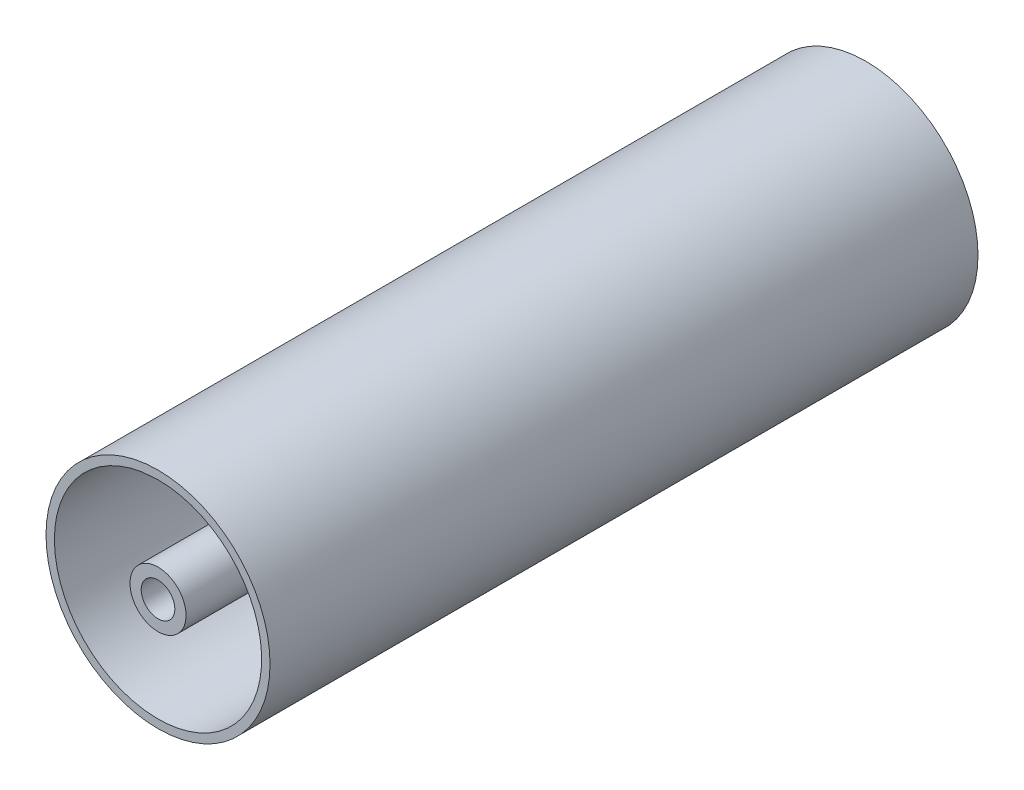
ISO-10303-21;
HEADER;
FILE_DESCRIPTION(('STEP AP214'),'2;1');
FILE_NAME('part.step','',(''),(''),'','','');
FILE_SCHEMA(('AUTOMOTIVE_DESIGN { 1 0 10303 214 1 1 1 1 }'));
ENDSEC;
DATA;
#1=APPLICATION_CONTEXT('core data for automotive mechanical design processes');
#2=APPLICATION_PROTOCOL_DEFINITION('international standard','automotive_design',2000,#1);
#3=PRODUCT_CONTEXT('',#1,'mechanical');
#4=PRODUCT('Part','Part','',(#3));
#5=PRODUCT_RELATED_PRODUCT_CATEGORY('part','',(#4));
#6=PRODUCT_DEFINITION_FORMATION('','',#4);
#7=PRODUCT_DEFINITION_CONTEXT('part definition',#1,'design');
#8=PRODUCT_DEFINITION('design','',#6,#7);
#9=PRODUCT_DEFINITION_SHAPE('','',#8);
#10=(LENGTH_UNIT() NAMED_UNIT(*) SI_UNIT(.MILLI.,.METRE.));
#11=(NAMED_UNIT(*) PLANE_ANGLE_UNIT() SI_UNIT($,.RADIAN.));
#12=(NAMED_UNIT(*) SI_UNIT($,.STERADIAN.) SOLID_ANGLE_UNIT());
#13=UNCERTAINTY_MEASURE_WITH_UNIT(LENGTH_MEASURE(1.E-05),#10,'distance_accuracy_value','');
#14=(GEOMETRIC_REPRESENTATION_CONTEXT(3) GLOBAL_UNCERTAINTY_ASSIGNED_CONTEXT((#13)) GLOBAL_UNIT_ASSIGNED_CONTEXT((#10,
#11,#12)) REPRESENTATION_CONTEXT('',''));
#15=CARTESIAN_POINT('',(0.,0.,0.));
#16=DIRECTION('',(0.,0.,1.));
#17=DIRECTION('',(1.,0.,0.));
#18=AXIS2_PLACEMENT_3D('',#15,#16,#17);
#19=CARTESIAN_POINT('',(0.,0.,53.257864376273));
#20=DIRECTION('',(0.,0.,1.));
#21=DIRECTION('',(1.,0.,0.));
#22=AXIS2_PLACEMENT_3D('',#19,#20,#21);
#23=CYLINDRICAL_SURFACE('',#22,4.99999999999862);
#24=CARTESIAN_POINT('',(0.,0.,126.4));
#25=DIRECTION('',(0.,0.,1.));
#26=DIRECTION('',(1.,0.,0.));
#27=AXIS2_PLACEMENT_3D('',#24,#25,#26);
#28=CIRCLE('',#27,4.99999999999862);
#29=CARTESIAN_POINT('',(4.99999999999862,0.,126.4));
#30=VERTEX_POINT('',#29);
#31=EDGE_CURVE('E59',#30,#30,#28,.T.);
#32=ORIENTED_EDGE('',*,*,#31,.F.);
#33=EDGE_LOOP('',(#32));
#34=FACE_BOUND('',#33,.T.);
#35=CARTESIAN_POINT('',(0.,0.,67.8));
#36=DIRECTION('',(0.,0.,-1.));
#37=DIRECTION('',(-1.,0.,0.));
#38=AXIS2_PLACEMENT_3D('',#35,#36,#37);
#39=CIRCLE('',#38,4.99999999999862);
#40=CARTESIAN_POINT('',(-4.99999999999862,0.,67.8));
#41=VERTEX_POINT('',#40);
#42=EDGE_CURVE('E55',#41,#41,#39,.F.);
#43=ORIENTED_EDGE('',*,*,#42,.T.);
#44=EDGE_LOOP('',(#43));
#45=FACE_BOUND('',#44,.T.);
#46=ADVANCED_FACE('F51',(#34,#45),#23,.T.);
#47=CARTESIAN_POINT('',(0.,0.,53.257864376273));
#48=DIRECTION('',(0.,0.,1.));
#49=DIRECTION('',(1.,0.,0.));
#50=AXIS2_PLACEMENT_3D('',#47,#48,#49);
#51=CYLINDRICAL_SURFACE('',#50,2.99999999999862);
#52=CARTESIAN_POINT('',(0.,0.,126.4));
#53=DIRECTION('',(0.,0.,1.));
#54=DIRECTION('',(1.,0.,0.));
#55=AXIS2_PLACEMENT_3D('',#52,#53,#54);
#56=CIRCLE('',#55,2.99999999999862);
#57=CARTESIAN_POINT('',(2.99999999999862,0.,126.4));
#58=VERTEX_POINT('',#57);
#59=EDGE_CURVE('E63',#58,#58,#56,.T.);
#60=ORIENTED_EDGE('',*,*,#59,.T.);
#61=EDGE_LOOP('',(#60));
#62=FACE_BOUND('',#61,.T.);
#63=CARTESIAN_POINT('',(0.,0.,67.8));
#64=DIRECTION('',(0.,0.,-1.));
#65=DIRECTION('',(-1.,0.,0.));
#66=AXIS2_PLACEMENT_3D('',#63,#64,#65);
#67=CIRCLE('',#66,2.99999999999862);
#68=CARTESIAN_POINT('',(-2.99999999999862,0.,67.8));
#69=VERTEX_POINT('',#68);
#70=EDGE_CURVE('E12',#69,#69,#67,.F.);
#71=ORIENTED_EDGE('',*,*,#70,.F.);
#72=EDGE_LOOP('',(#71));
#73=FACE_BOUND('',#72,.T.);
#74=ADVANCED_FACE('F78',(#62,#73),#51,.F.);
#75=CARTESIAN_POINT('',(0.,0.,126.4));
#76=DIRECTION('',(0.,0.,1.));
#77=DIRECTION('',(1.,0.,0.));
#78=AXIS2_PLACEMENT_3D('',#75,#76,#77);
#79=PLANE('',#78);
#80=ORIENTED_EDGE('',*,*,#59,.F.);
#81=EDGE_LOOP('',(#80));
#82=FACE_BOUND('',#81,.T.);
#83=ORIENTED_EDGE('',*,*,#31,.T.);
#84=EDGE_LOOP('',(#83));
#85=FACE_BOUND('',#84,.T.);
#86=ADVANCED_FACE('F74',(#82,#85),#79,.T.);
#87=CARTESIAN_POINT('',(2.05508176448488E-07,-2.52625562309483E-06,67.8));
#88=DIRECTION('',(0.,0.,-1.));
#89=DIRECTION('',(-1.,0.,0.));
#90=AXIS2_PLACEMENT_3D('',#87,#88,#89);
#91=PLANE('',#90);
#92=ORIENTED_EDGE('',*,*,#42,.F.);
#93=EDGE_LOOP('',(#92));
#94=FACE_BOUND('',#93,.T.);
#95=ORIENTED_EDGE('',*,*,#70,.T.);
#96=EDGE_LOOP('',(#95));
#97=FACE_BOUND('',#96,.T.);
#98=ADVANCED_FACE('F53',(#94,#97),#91,.T.);
#99=CLOSED_SHELL('',(#46,#74,#86,#98));
#100=MANIFOLD_SOLID_BREP('B2',#99);
#101=CARTESIAN_POINT('',(-7.41124908692476,8.1285538056629,126.4));
#102=DIRECTION('',(0.,0.,-1.));
#103=DIRECTION('',(-1.,0.,0.));
#104=AXIS2_PLACEMENT_3D('',#101,#102,#103);
#105=CYLINDRICAL_SURFACE('',#104,6.);
#106=CARTESIAN_POINT('',(-7.41124908692476,8.1285538056629,67.4));
#107=DIRECTION('',(0.,0.,-1.));
#108=DIRECTION('',(-1.,0.,0.));
#109=AXIS2_PLACEMENT_3D('',#106,#107,#108);
#110=CIRCLE('',#109,6.);
#111=CARTESIAN_POINT('',(-1.49013878743609,9.09832327377844,67.4));
#112=VERTEX_POINT('',#111);
#113=CARTESIAN_POINT('',(-3.3687495849658,3.69479718439223,67.4));
#114=VERTEX_POINT('',#113);
#115=EDGE_CURVE('E275',#112,#114,#110,.T.);
#116=ORIENTED_EDGE('',*,*,#115,.F.);
#117=DIRECTION('',(0.,0.,-1.));
#118=VECTOR('',#117,1.);
#119=CARTESIAN_POINT('',(-1.49013878743609,9.09832327377844,126.4));
#120=LINE('',#119,#118);
#121=CARTESIAN_POINT('',(-1.49013878743609,9.09832327377844,59.));
#122=VERTEX_POINT('',#121);
#123=EDGE_CURVE('E130',#112,#122,#120,.T.);
#124=ORIENTED_EDGE('',*,*,#123,.T.);
#125=CARTESIAN_POINT('',(-7.41124908692476,8.1285538056629,59.));
#126=DIRECTION('',(0.,0.,-1.));
#127=DIRECTION('',(-1.,0.,0.));
#128=AXIS2_PLACEMENT_3D('',#125,#126,#127);
#129=CIRCLE('',#128,6.);
#130=CARTESIAN_POINT('',(-3.3687495849658,3.69479718439223,59.));
#131=VERTEX_POINT('',#130);
#132=EDGE_CURVE('E253',#122,#131,#129,.T.);
#133=ORIENTED_EDGE('',*,*,#132,.T.);
#134=DIRECTION('',(0.,0.,-1.));
#135=VECTOR('',#134,1.);
#136=CARTESIAN_POINT('',(-3.3687495849658,3.69479718439223,126.4));
#137=LINE('',#136,#135);
#138=EDGE_CURVE('E226',#114,#131,#137,.T.);
#139=ORIENTED_EDGE('',*,*,#138,.F.);
#140=EDGE_LOOP('',(#116,#124,#133,#139));
#141=FACE_BOUND('',#140,.T.);
#142=ADVANCED_FACE('F113',(#141),#105,.F.);
#143=CARTESIAN_POINT('',(0.,0.,126.4));
#144=DIRECTION('',(0.,0.,-1.));
#145=DIRECTION('',(-1.,0.,0.));
#146=AXIS2_PLACEMENT_3D('',#143,#144,#145);
#147=CYLINDRICAL_SURFACE('',#146,5.);
#148=CARTESIAN_POINT('',(0.,0.,67.4));
#149=DIRECTION('',(0.,0.,-1.));
#150=DIRECTION('',(-1.,0.,0.));
#151=AXIS2_PLACEMENT_3D('',#148,#149,#150);
#152=CIRCLE('',#151,5.);
#153=CARTESIAN_POINT('',(2.72727272727273,4.19070202604222,67.4));
#154=VERTEX_POINT('',#153);
#155=EDGE_CURVE('E274',#114,#154,#152,.F.);
#156=ORIENTED_EDGE('',*,*,#155,.F.);
#157=ORIENTED_EDGE('',*,*,#138,.T.);
#158=CARTESIAN_POINT('',(0.,0.,59.));
#159=DIRECTION('',(0.,0.,-1.));
#160=DIRECTION('',(-1.,0.,0.));
#161=AXIS2_PLACEMENT_3D('',#158,#159,#160);
#162=CIRCLE('',#161,5.);
#163=CARTESIAN_POINT('',(2.72727272727273,4.19070202604222,59.));
#164=VERTEX_POINT('',#163);
#165=EDGE_CURVE('E255',#131,#164,#162,.F.);
#166=ORIENTED_EDGE('',*,*,#165,.T.);
#167=DIRECTION('',(0.,0.,-1.));
#168=VECTOR('',#167,1.);
#169=CARTESIAN_POINT('',(2.72727272727273,4.19070202604222,126.4));
#170=LINE('',#169,#168);
#171=EDGE_CURVE('E216',#154,#164,#170,.T.);
#172=ORIENTED_EDGE('',*,*,#171,.F.);
#173=EDGE_LOOP('',(#156,#157,#166,#172));
#174=FACE_BOUND('',#173,.T.);
#175=ADVANCED_FACE('F272',(#174),#147,.T.);
#176=CARTESIAN_POINT('',(6.,9.21954445729289,126.4));
#177=DIRECTION('',(0.,0.,-1.));
#178=DIRECTION('',(-1.,0.,0.));
#179=AXIS2_PLACEMENT_3D('',#176,#177,#178);
#180=CYLINDRICAL_SURFACE('',#179,6.);
#181=CARTESIAN_POINT('',(6.,9.21954445729289,67.4));
#182=DIRECTION('',(0.,0.,-1.));
#183=DIRECTION('',(-1.,0.,0.));
#184=AXIS2_PLACEMENT_3D('',#181,#182,#183);
#185=CIRCLE('',#184,6.);
#186=CARTESIAN_POINT('',(0.,9.21954445729289,67.4));
#187=VERTEX_POINT('',#186);
#188=EDGE_CURVE('E189',#154,#187,#185,.T.);
#189=ORIENTED_EDGE('',*,*,#188,.F.);
#190=ORIENTED_EDGE('',*,*,#171,.T.);
#191=CARTESIAN_POINT('',(6.,9.21954445729289,59.));
#192=DIRECTION('',(0.,0.,-1.));
#193=DIRECTION('',(-1.,0.,0.));
#194=AXIS2_PLACEMENT_3D('',#191,#192,#193);
#195=CIRCLE('',#194,6.);
#196=CARTESIAN_POINT('',(0.,9.21954445729289,59.));
#197=VERTEX_POINT('',#196);
#198=EDGE_CURVE('E258',#164,#197,#195,.T.);
#199=ORIENTED_EDGE('',*,*,#198,.T.);
#200=DIRECTION('',(0.,0.,-1.));
#201=VECTOR('',#200,1.);
#202=CARTESIAN_POINT('',(0.,9.21954445729289,126.4));
#203=LINE('',#202,#201);
#204=EDGE_CURVE('E215',#187,#197,#203,.T.);
#205=ORIENTED_EDGE('',*,*,#204,.F.);
#206=EDGE_LOOP('',(#189,#190,#199,#205));
#207=FACE_BOUND('',#206,.T.);
#208=ADVANCED_FACE('F265',(#207),#180,.F.);
#209=CARTESIAN_POINT('',(0.,18.5,126.4));
#210=DIRECTION('',(1.,0.,0.));
#211=DIRECTION('',(0.,1.,0.));
#212=AXIS2_PLACEMENT_3D('',#209,#210,#211);
#213=PLANE('',#212);
#214=DIRECTION('',(0.,1.,0.));
#215=VECTOR('',#214,1.);
#216=CARTESIAN_POINT('',(0.,18.5,67.4));
#217=LINE('',#216,#215);
#218=CARTESIAN_POINT('',(0.,18.5,67.4));
#219=VERTEX_POINT('',#218);
#220=EDGE_CURVE('E182',#187,#219,#217,.T.);
#221=ORIENTED_EDGE('',*,*,#220,.F.);
#222=ORIENTED_EDGE('',*,*,#204,.T.);
#223=DIRECTION('',(0.,1.,0.));
#224=VECTOR('',#223,1.);
#225=CARTESIAN_POINT('',(0.,18.5,59.));
#226=LINE('',#225,#224);
#227=CARTESIAN_POINT('',(0.,18.5,59.));
#228=VERTEX_POINT('',#227);
#229=EDGE_CURVE('E205',#197,#228,#226,.T.);
#230=ORIENTED_EDGE('',*,*,#229,.T.);
#231=DIRECTION('',(0.,0.,-1.));
#232=VECTOR('',#231,1.);
#233=CARTESIAN_POINT('',(0.,18.5,126.4));
#234=LINE('',#233,#232);
#235=EDGE_CURVE('E202',#219,#228,#234,.T.);
#236=ORIENTED_EDGE('',*,*,#235,.F.);
#237=EDGE_LOOP('',(#221,#222,#230,#236));
#238=FACE_BOUND('',#237,.T.);
#239=ADVANCED_FACE('F203',(#238),#213,.T.);
#240=CARTESIAN_POINT('',(-2.99012252668958,18.2567567567568,126.4));
#241=DIRECTION('',(-0.986851716581446,-0.161628244685923,0.));
#242=DIRECTION('',(0.161628244685923,-0.986851716581447,0.));
#243=AXIS2_PLACEMENT_3D('',#240,#241,#242);
#244=PLANE('',#243);
#245=DIRECTION('',(0.161628244685923,-0.986851716581447,0.));
#246=VECTOR('',#245,1.);
#247=CARTESIAN_POINT('',(-2.99012252668958,18.2567567567568,67.4));
#248=LINE('',#247,#246);
#249=CARTESIAN_POINT('',(-2.99012252668958,18.2567567567568,67.4));
#250=VERTEX_POINT('',#249);
#251=EDGE_CURVE('E279',#250,#112,#248,.T.);
#252=ORIENTED_EDGE('',*,*,#251,.F.);
#253=DIRECTION('',(0.,0.,-1.));
#254=VECTOR('',#253,1.);
#255=CARTESIAN_POINT('',(-2.99012252668958,18.2567567567568,126.4));
#256=LINE('',#255,#254);
#257=CARTESIAN_POINT('',(-2.99012252668958,18.2567567567568,59.));
#258=VERTEX_POINT('',#257);
#259=EDGE_CURVE('E221',#250,#258,#256,.T.);
#260=ORIENTED_EDGE('',*,*,#259,.T.);
#261=DIRECTION('',(0.161628244685923,-0.986851716581447,0.));
#262=VECTOR('',#261,1.);
#263=CARTESIAN_POINT('',(-2.99012252668958,18.2567567567568,59.));
#264=LINE('',#263,#262);
#265=EDGE_CURVE('E245',#258,#122,#264,.T.);
#266=ORIENTED_EDGE('',*,*,#265,.T.);
#267=ORIENTED_EDGE('',*,*,#123,.F.);
#268=EDGE_LOOP('',(#252,#260,#266,#267));
#269=FACE_BOUND('',#268,.T.);
#270=ADVANCED_FACE('F278',(#269),#244,.T.);
#271=CARTESIAN_POINT('',(0.,0.,126.4));
#272=DIRECTION('',(0.,0.,-1.));
#273=DIRECTION('',(-1.,0.,0.));
#274=AXIS2_PLACEMENT_3D('',#271,#272,#273);
#275=CYLINDRICAL_SURFACE('',#274,3.);
#276=CARTESIAN_POINT('',(0.,0.,67.4));
#277=DIRECTION('',(0.,0.,-1.));
#278=DIRECTION('',(-1.,0.,0.));
#279=AXIS2_PLACEMENT_3D('',#276,#277,#278);
#280=CIRCLE('',#279,3.);
#281=CARTESIAN_POINT('',(-3.,0.,67.4));
#282=VERTEX_POINT('',#281);
#283=EDGE_CURVE('E199',#282,#282,#280,.F.);
#284=ORIENTED_EDGE('',*,*,#283,.T.);
#285=EDGE_LOOP('',(#284));
#286=FACE_BOUND('',#285,.T.);
#287=CARTESIAN_POINT('',(0.,0.,59.));
#288=DIRECTION('',(0.,0.,-1.));
#289=DIRECTION('',(-1.,0.,0.));
#290=AXIS2_PLACEMENT_3D('',#287,#288,#289);
#291=CIRCLE('',#290,3.);
#292=CARTESIAN_POINT('',(-3.,0.,59.));
#293=VERTEX_POINT('',#292);
#294=EDGE_CURVE('E117',#293,#293,#291,.F.);
#295=ORIENTED_EDGE('',*,*,#294,.F.);
#296=EDGE_LOOP('',(#295));
#297=FACE_BOUND('',#296,.T.);
#298=ADVANCED_FACE('F311',(#286,#297),#275,.F.);
#299=CARTESIAN_POINT('',(0.,0.,126.4));
#300=DIRECTION('',(0.,0.,1.));
#301=DIRECTION('',(1.,0.,0.));
#302=AXIS2_PLACEMENT_3D('',#299,#300,#301);
#303=PLANE('',#302);
#304=DIRECTION('',(-0.996707508896528,-0.0810810810810807,0.));
#305=VECTOR('',#304,1.);
#306=CARTESIAN_POINT('',(0.,18.5,126.4));
#307=LINE('',#306,#305);
#308=CARTESIAN_POINT('',(0.,18.5,126.4));
#309=VERTEX_POINT('',#308);
#310=CARTESIAN_POINT('',(-2.99012252668958,18.2567567567568,126.4));
#311=VERTEX_POINT('',#310);
#312=EDGE_CURVE('E138',#309,#311,#307,.T.);
#313=ORIENTED_EDGE('',*,*,#312,.F.);
#314=CARTESIAN_POINT('',(0.,0.,126.4));
#315=DIRECTION('',(0.,0.,1.));
#316=DIRECTION('',(1.,0.,0.));
#317=AXIS2_PLACEMENT_3D('',#314,#315,#316);
#318=CIRCLE('',#317,18.5);
#319=EDGE_CURVE('E214',#311,#309,#318,.T.);
#320=ORIENTED_EDGE('',*,*,#319,.F.);
#321=EDGE_LOOP('',(#313,#320));
#322=FACE_BOUND('',#321,.T.);
#323=CARTESIAN_POINT('',(0.,0.,126.4));
#324=DIRECTION('',(0.,0.,1.));
#325=DIRECTION('',(1.,0.,0.));
#326=AXIS2_PLACEMENT_3D('',#323,#324,#325);
#327=CIRCLE('',#326,20.);
#328=CARTESIAN_POINT('',(20.,0.,126.4));
#329=VERTEX_POINT('',#328);
#330=EDGE_CURVE('E49',#329,#329,#327,.T.);
#331=ORIENTED_EDGE('',*,*,#330,.T.);
#332=EDGE_LOOP('',(#331));
#333=FACE_BOUND('',#332,.T.);
#334=ADVANCED_FACE('F234',(#322,#333),#303,.T.);
#335=CARTESIAN_POINT('',(0.,0.,0.));
#336=DIRECTION('',(0.,0.,1.));
#337=DIRECTION('',(1.,0.,0.));
#338=AXIS2_PLACEMENT_3D('',#335,#336,#337);
#339=PLANE('',#338);
#340=CARTESIAN_POINT('',(0.,0.,0.));
#341=DIRECTION('',(0.,0.,1.));
#342=DIRECTION('',(1.,0.,0.));
#343=AXIS2_PLACEMENT_3D('',#340,#341,#342);
#344=CIRCLE('',#343,20.);
#345=CARTESIAN_POINT('',(20.,0.,0.));
#346=VERTEX_POINT('',#345);
#347=EDGE_CURVE('E122',#346,#346,#344,.T.);
#348=ORIENTED_EDGE('',*,*,#347,.F.);
#349=EDGE_LOOP('',(#348));
#350=FACE_BOUND('',#349,.T.);
#351=CARTESIAN_POINT('',(0.,0.,0.));
#352=DIRECTION('',(0.,0.,1.));
#353=DIRECTION('',(1.,0.,0.));
#354=AXIS2_PLACEMENT_3D('',#351,#352,#353);
#355=CIRCLE('',#354,18.5);
#356=CARTESIAN_POINT('',(-2.99012252668958,18.2567567567568,0.));
#357=VERTEX_POINT('',#356);
#358=CARTESIAN_POINT('',(0.,18.5,0.));
#359=VERTEX_POINT('',#358);
#360=EDGE_CURVE('E224',#357,#359,#355,.T.);
#361=ORIENTED_EDGE('',*,*,#360,.T.);
#362=DIRECTION('',(0.996707508896528,0.0810810810810807,0.));
#363=VECTOR('',#362,1.);
#364=CARTESIAN_POINT('',(0.,18.5,0.));
#365=LINE('',#364,#363);
#366=EDGE_CURVE('E193',#357,#359,#365,.T.);
#367=ORIENTED_EDGE('',*,*,#366,.F.);
#368=EDGE_LOOP('',(#361,#367));
#369=FACE_BOUND('',#368,.T.);
#370=ADVANCED_FACE('F231',(#350,#369),#339,.F.);
#371=CARTESIAN_POINT('',(0.,0.,126.4));
#372=DIRECTION('',(0.,0.,-1.));
#373=DIRECTION('',(-1.,0.,0.));
#374=AXIS2_PLACEMENT_3D('',#371,#372,#373);
#375=CYLINDRICAL_SURFACE('',#374,20.);
#376=ORIENTED_EDGE('',*,*,#330,.F.);
#377=EDGE_LOOP('',(#376));
#378=FACE_BOUND('',#377,.T.);
#379=ORIENTED_EDGE('',*,*,#347,.T.);
#380=EDGE_LOOP('',(#379));
#381=FACE_BOUND('',#380,.T.);
#382=ADVANCED_FACE('F115',(#378,#381),#375,.T.);
#383=CARTESIAN_POINT('',(0.,0.,126.4));
#384=DIRECTION('',(0.,0.,-1.));
#385=DIRECTION('',(-1.,0.,0.));
#386=AXIS2_PLACEMENT_3D('',#383,#384,#385);
#387=CYLINDRICAL_SURFACE('',#386,18.5);
#388=ORIENTED_EDGE('',*,*,#259,.F.);
#389=EDGE_CURVE('E198',#311,#250,#256,.T.);
#390=ORIENTED_EDGE('',*,*,#389,.F.);
#391=ORIENTED_EDGE('',*,*,#319,.T.);
#392=EDGE_CURVE('E197',#309,#219,#234,.T.);
#393=ORIENTED_EDGE('',*,*,#392,.T.);
#394=ORIENTED_EDGE('',*,*,#235,.T.);
#395=DIRECTION('',(0.,0.,-1.));
#396=VECTOR('',#395,1.);
#397=CARTESIAN_POINT('',(0.,18.5,59.));
#398=LINE('',#397,#396);
#399=EDGE_CURVE('E239',#228,#359,#398,.T.);
#400=ORIENTED_EDGE('',*,*,#399,.T.);
#401=ORIENTED_EDGE('',*,*,#360,.F.);
#402=DIRECTION('',(0.,0.,-1.));
#403=VECTOR('',#402,1.);
#404=CARTESIAN_POINT('',(-2.99012252668958,18.2567567567568,59.));
#405=LINE('',#404,#403);
#406=EDGE_CURVE('E238',#258,#357,#405,.T.);
#407=ORIENTED_EDGE('',*,*,#406,.F.);
#408=EDGE_LOOP('',(#388,#390,#391,#393,#394,#400,#401,#407));
#409=FACE_BOUND('',#408,.T.);
#410=ADVANCED_FACE('F212',(#409),#387,.F.);
#411=CARTESIAN_POINT('',(0.,-5.01335084557297E-13,59.));
#412=DIRECTION('',(0.,0.,-1.));
#413=DIRECTION('',(-1.,0.,0.));
#414=AXIS2_PLACEMENT_3D('',#411,#412,#413);
#415=PLANE('',#414);
#416=ORIENTED_EDGE('',*,*,#198,.F.);
#417=ORIENTED_EDGE('',*,*,#165,.F.);
#418=ORIENTED_EDGE('',*,*,#132,.F.);
#419=ORIENTED_EDGE('',*,*,#265,.F.);
#420=DIRECTION('',(0.996707508896528,0.0810810810810807,0.));
#421=VECTOR('',#420,1.);
#422=CARTESIAN_POINT('',(0.,18.5,59.));
#423=LINE('',#422,#421);
#424=EDGE_CURVE('E246',#258,#228,#423,.T.);
#425=ORIENTED_EDGE('',*,*,#424,.T.);
#426=ORIENTED_EDGE('',*,*,#229,.F.);
#427=EDGE_LOOP('',(#416,#417,#418,#419,#425,#426));
#428=FACE_BOUND('',#427,.T.);
#429=ORIENTED_EDGE('',*,*,#294,.T.);
#430=EDGE_LOOP('',(#429));
#431=FACE_BOUND('',#430,.T.);
#432=ADVANCED_FACE('F270',(#428,#431),#415,.T.);
#433=CARTESIAN_POINT('',(0.,18.5,59.));
#434=DIRECTION('',(-0.0810810810810807,0.996707508896528,0.));
#435=DIRECTION('',(-0.996707508896528,-0.0810810810810807,0.));
#436=AXIS2_PLACEMENT_3D('',#433,#434,#435);
#437=PLANE('',#436);
#438=ORIENTED_EDGE('',*,*,#366,.T.);
#439=ORIENTED_EDGE('',*,*,#399,.F.);
#440=ORIENTED_EDGE('',*,*,#424,.F.);
#441=ORIENTED_EDGE('',*,*,#406,.T.);
#442=EDGE_LOOP('',(#438,#439,#440,#441));
#443=FACE_BOUND('',#442,.T.);
#444=ADVANCED_FACE('F289',(#443),#437,.F.);
#445=CARTESIAN_POINT('',(2.05508176448488E-07,-2.52625562309483E-06,67.4));
#446=DIRECTION('',(0.,0.,-1.));
#447=DIRECTION('',(-1.,0.,0.));
#448=AXIS2_PLACEMENT_3D('',#445,#446,#447);
#449=PLANE('',#448);
#450=ORIENTED_EDGE('',*,*,#220,.T.);
#451=DIRECTION('',(-0.996707508896528,-0.0810810810810807,0.));
#452=VECTOR('',#451,1.);
#453=CARTESIAN_POINT('',(0.,18.5,67.4));
#454=LINE('',#453,#452);
#455=EDGE_CURVE('E186',#219,#250,#454,.T.);
#456=ORIENTED_EDGE('',*,*,#455,.T.);
#457=ORIENTED_EDGE('',*,*,#251,.T.);
#458=ORIENTED_EDGE('',*,*,#115,.T.);
#459=ORIENTED_EDGE('',*,*,#155,.T.);
#460=ORIENTED_EDGE('',*,*,#188,.T.);
#461=EDGE_LOOP('',(#450,#456,#457,#458,#459,#460));
#462=FACE_BOUND('',#461,.T.);
#463=ORIENTED_EDGE('',*,*,#283,.F.);
#464=EDGE_LOOP('',(#463));
#465=FACE_BOUND('',#464,.T.);
#466=ADVANCED_FACE('F184',(#462,#465),#449,.F.);
#467=CARTESIAN_POINT('',(0.,18.5,67.4));
#468=DIRECTION('',(-0.0810810810810807,0.996707508896528,0.));
#469=DIRECTION('',(-0.996707508896528,-0.0810810810810807,0.));
#470=AXIS2_PLACEMENT_3D('',#467,#468,#469);
#471=PLANE('',#470);
#472=ORIENTED_EDGE('',*,*,#312,.T.);
#473=ORIENTED_EDGE('',*,*,#389,.T.);
#474=ORIENTED_EDGE('',*,*,#455,.F.);
#475=ORIENTED_EDGE('',*,*,#392,.F.);
#476=EDGE_LOOP('',(#472,#473,#474,#475));
#477=FACE_BOUND('',#476,.T.);
#478=ADVANCED_FACE('F195',(#477),#471,.F.);
#479=CLOSED_SHELL('',(#142,#175,#208,#239,#270,#298,#334,#370,#382,#410,#432,#444,#466,#478));
#480=MANIFOLD_SOLID_BREP('B7',#479);
#481=ADVANCED_BREP_SHAPE_REPRESENTATION('',(#18,#100,#480),#14);
#482=SHAPE_DEFINITION_REPRESENTATION(#9,#481);
ENDSEC;
END-ISO-10303-21;
